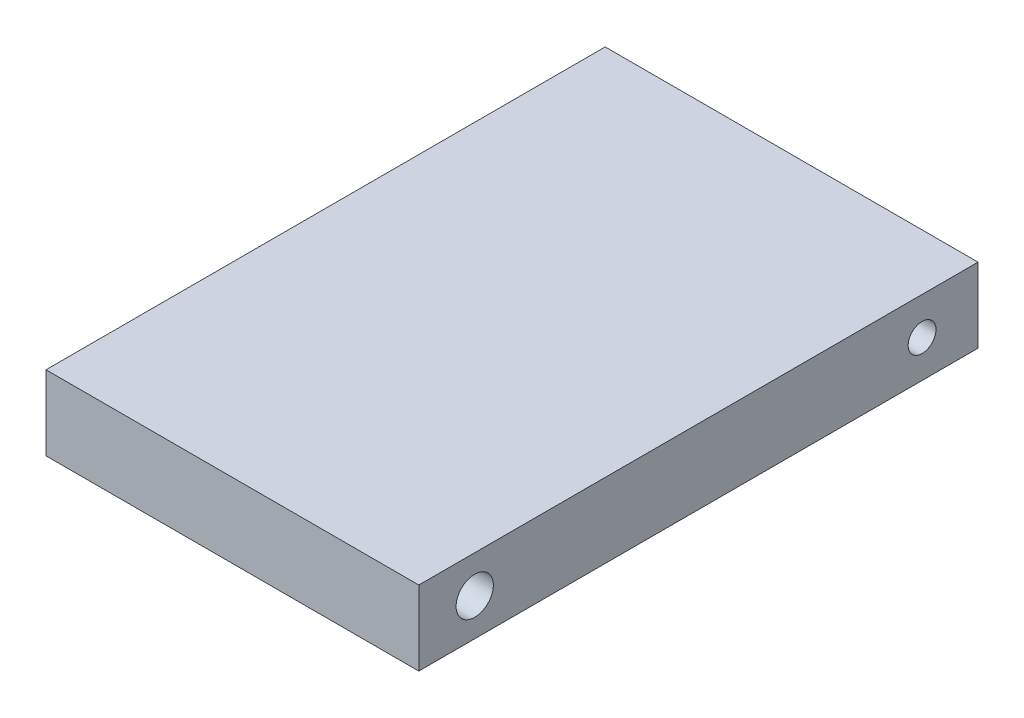
ISO-10303-21;
HEADER;
FILE_DESCRIPTION(('STEP AP214'),'2;1');
FILE_NAME('part.step','',(''),(''),'','','');
FILE_SCHEMA(('AUTOMOTIVE_DESIGN { 1 0 10303 214 1 1 1 1 }'));
ENDSEC;
DATA;
#1=APPLICATION_CONTEXT('core data for automotive mechanical design processes');
#2=APPLICATION_PROTOCOL_DEFINITION('international standard','automotive_design',2000,#1);
#3=PRODUCT_CONTEXT('',#1,'mechanical');
#4=PRODUCT('Part','Part','',(#3));
#5=PRODUCT_RELATED_PRODUCT_CATEGORY('part','',(#4));
#6=PRODUCT_DEFINITION_FORMATION('','',#4);
#7=PRODUCT_DEFINITION_CONTEXT('part definition',#1,'design');
#8=PRODUCT_DEFINITION('design','',#6,#7);
#9=PRODUCT_DEFINITION_SHAPE('','',#8);
#10=(LENGTH_UNIT() NAMED_UNIT(*) SI_UNIT(.MILLI.,.METRE.));
#11=(NAMED_UNIT(*) PLANE_ANGLE_UNIT() SI_UNIT($,.RADIAN.));
#12=(NAMED_UNIT(*) SI_UNIT($,.STERADIAN.) SOLID_ANGLE_UNIT());
#13=UNCERTAINTY_MEASURE_WITH_UNIT(LENGTH_MEASURE(1.E-05),#10,'distance_accuracy_value','');
#14=(GEOMETRIC_REPRESENTATION_CONTEXT(3) GLOBAL_UNCERTAINTY_ASSIGNED_CONTEXT((#13)) GLOBAL_UNIT_ASSIGNED_CONTEXT((#10,
#11,#12)) REPRESENTATION_CONTEXT('',''));
#15=CARTESIAN_POINT('',(0.,0.,0.));
#16=DIRECTION('',(0.,0.,1.));
#17=DIRECTION('',(1.,0.,0.));
#18=AXIS2_PLACEMENT_3D('',#15,#16,#17);
#19=CARTESIAN_POINT('',(0.,25.4,-190.5));
#20=DIRECTION('',(1.,0.,0.));
#21=DIRECTION('',(0.,0.,-1.));
#22=AXIS2_PLACEMENT_3D('',#19,#20,#21);
#23=PLANE('',#22);
#24=CARTESIAN_POINT('',(0.,12.7,-171.45));
#25=DIRECTION('',(-1.,0.,0.));
#26=DIRECTION('',(0.,0.,1.));
#27=AXIS2_PLACEMENT_3D('',#24,#25,#26);
#28=CIRCLE('',#27,6.35);
#29=CARTESIAN_POINT('',(0.,12.7,-165.1));
#30=VERTEX_POINT('',#29);
#31=EDGE_CURVE('E128',#30,#30,#28,.T.);
#32=ORIENTED_EDGE('',*,*,#31,.F.);
#33=EDGE_LOOP('',(#32));
#34=FACE_BOUND('',#33,.T.);
#35=CARTESIAN_POINT('',(0.,12.7,-19.05));
#36=DIRECTION('',(-1.,0.,0.));
#37=DIRECTION('',(0.,0.,1.));
#38=AXIS2_PLACEMENT_3D('',#35,#36,#37);
#39=CIRCLE('',#38,6.35);
#40=CARTESIAN_POINT('',(0.,12.7,-12.7));
#41=VERTEX_POINT('',#40);
#42=EDGE_CURVE('E122',#41,#41,#39,.T.);
#43=ORIENTED_EDGE('',*,*,#42,.F.);
#44=EDGE_LOOP('',(#43));
#45=FACE_BOUND('',#44,.T.);
#46=DIRECTION('',(0.,0.,1.));
#47=VECTOR('',#46,1.);
#48=CARTESIAN_POINT('',(0.,0.,-190.5));
#49=LINE('',#48,#47);
#50=CARTESIAN_POINT('',(0.,0.,-190.5));
#51=VERTEX_POINT('',#50);
#52=CARTESIAN_POINT('',(0.,0.,0.));
#53=VERTEX_POINT('',#52);
#54=EDGE_CURVE('E96',#51,#53,#49,.T.);
#55=ORIENTED_EDGE('',*,*,#54,.T.);
#56=DIRECTION('',(0.,-1.,0.));
#57=VECTOR('',#56,1.);
#58=CARTESIAN_POINT('',(0.,25.4,0.));
#59=LINE('',#58,#57);
#60=CARTESIAN_POINT('',(0.,25.4,0.));
#61=VERTEX_POINT('',#60);
#62=EDGE_CURVE('E11',#61,#53,#59,.T.);
#63=ORIENTED_EDGE('',*,*,#62,.F.);
#64=DIRECTION('',(0.,0.,1.));
#65=VECTOR('',#64,1.);
#66=CARTESIAN_POINT('',(0.,25.4,-190.5));
#67=LINE('',#66,#65);
#68=CARTESIAN_POINT('',(0.,25.4,-190.5));
#69=VERTEX_POINT('',#68);
#70=EDGE_CURVE('E84',#69,#61,#67,.T.);
#71=ORIENTED_EDGE('',*,*,#70,.F.);
#72=DIRECTION('',(0.,-1.,0.));
#73=VECTOR('',#72,1.);
#74=CARTESIAN_POINT('',(0.,25.4,-190.5));
#75=LINE('',#74,#73);
#76=EDGE_CURVE('E92',#69,#51,#75,.T.);
#77=ORIENTED_EDGE('',*,*,#76,.T.);
#78=EDGE_LOOP('',(#55,#63,#71,#77));
#79=FACE_BOUND('',#78,.T.);
#80=ADVANCED_FACE('F33',(#34,#45,#79),#23,.F.);
#81=CARTESIAN_POINT('',(0.,25.4,0.));
#82=DIRECTION('',(0.,0.,-1.));
#83=DIRECTION('',(-1.,0.,0.));
#84=AXIS2_PLACEMENT_3D('',#81,#82,#83);
#85=PLANE('',#84);
#86=DIRECTION('',(1.,0.,0.));
#87=VECTOR('',#86,1.);
#88=CARTESIAN_POINT('',(0.,0.,0.));
#89=LINE('',#88,#87);
#90=CARTESIAN_POINT('',(127.,0.,0.));
#91=VERTEX_POINT('',#90);
#92=EDGE_CURVE('E88',#53,#91,#89,.T.);
#93=ORIENTED_EDGE('',*,*,#92,.T.);
#94=DIRECTION('',(0.,-1.,0.));
#95=VECTOR('',#94,1.);
#96=CARTESIAN_POINT('',(127.,25.4,0.));
#97=LINE('',#96,#95);
#98=CARTESIAN_POINT('',(127.,25.4,0.));
#99=VERTEX_POINT('',#98);
#100=EDGE_CURVE('E41',#99,#91,#97,.T.);
#101=ORIENTED_EDGE('',*,*,#100,.F.);
#102=DIRECTION('',(1.,0.,0.));
#103=VECTOR('',#102,1.);
#104=CARTESIAN_POINT('',(0.,25.4,0.));
#105=LINE('',#104,#103);
#106=EDGE_CURVE('E79',#61,#99,#105,.T.);
#107=ORIENTED_EDGE('',*,*,#106,.F.);
#108=ORIENTED_EDGE('',*,*,#62,.T.);
#109=EDGE_LOOP('',(#93,#101,#107,#108));
#110=FACE_BOUND('',#109,.T.);
#111=ADVANCED_FACE('F87',(#110),#85,.F.);
#112=CARTESIAN_POINT('',(127.,25.4,0.));
#113=DIRECTION('',(-1.,0.,0.));
#114=DIRECTION('',(0.,0.,1.));
#115=AXIS2_PLACEMENT_3D('',#112,#113,#114);
#116=PLANE('',#115);
#117=CARTESIAN_POINT('',(127.,12.7,-171.45));
#118=DIRECTION('',(1.,0.,0.));
#119=DIRECTION('',(0.,0.,-1.));
#120=AXIS2_PLACEMENT_3D('',#117,#118,#119);
#121=CIRCLE('',#120,4.74112595679173);
#122=CARTESIAN_POINT('',(127.,12.7,-176.191125956792));
#123=VERTEX_POINT('',#122);
#124=EDGE_CURVE('E116',#123,#123,#121,.T.);
#125=ORIENTED_EDGE('',*,*,#124,.F.);
#126=EDGE_LOOP('',(#125));
#127=FACE_BOUND('',#126,.T.);
#128=CARTESIAN_POINT('',(127.,12.7,-19.05));
#129=DIRECTION('',(1.,0.,0.));
#130=DIRECTION('',(0.,0.,-1.));
#131=AXIS2_PLACEMENT_3D('',#128,#129,#130);
#132=CIRCLE('',#131,6.35);
#133=CARTESIAN_POINT('',(127.,12.7,-25.4));
#134=VERTEX_POINT('',#133);
#135=EDGE_CURVE('E110',#134,#134,#132,.T.);
#136=ORIENTED_EDGE('',*,*,#135,.F.);
#137=EDGE_LOOP('',(#136));
#138=FACE_BOUND('',#137,.T.);
#139=DIRECTION('',(0.,0.,-1.));
#140=VECTOR('',#139,1.);
#141=CARTESIAN_POINT('',(127.,0.,0.));
#142=LINE('',#141,#140);
#143=CARTESIAN_POINT('',(127.,0.,-190.5));
#144=VERTEX_POINT('',#143);
#145=EDGE_CURVE('E66',#91,#144,#142,.T.);
#146=ORIENTED_EDGE('',*,*,#145,.T.);
#147=DIRECTION('',(0.,-1.,0.));
#148=VECTOR('',#147,1.);
#149=CARTESIAN_POINT('',(127.,25.4,-190.5));
#150=LINE('',#149,#148);
#151=CARTESIAN_POINT('',(127.,25.4,-190.5));
#152=VERTEX_POINT('',#151);
#153=EDGE_CURVE('E89',#152,#144,#150,.T.);
#154=ORIENTED_EDGE('',*,*,#153,.F.);
#155=DIRECTION('',(0.,0.,-1.));
#156=VECTOR('',#155,1.);
#157=CARTESIAN_POINT('',(127.,25.4,0.));
#158=LINE('',#157,#156);
#159=EDGE_CURVE('E82',#99,#152,#158,.T.);
#160=ORIENTED_EDGE('',*,*,#159,.F.);
#161=ORIENTED_EDGE('',*,*,#100,.T.);
#162=EDGE_LOOP('',(#146,#154,#160,#161));
#163=FACE_BOUND('',#162,.T.);
#164=ADVANCED_FACE('F90',(#127,#138,#163),#116,.F.);
#165=CARTESIAN_POINT('',(127.,25.4,-190.5));
#166=DIRECTION('',(0.,0.,1.));
#167=DIRECTION('',(1.,0.,0.));
#168=AXIS2_PLACEMENT_3D('',#165,#166,#167);
#169=PLANE('',#168);
#170=DIRECTION('',(-1.,0.,0.));
#171=VECTOR('',#170,1.);
#172=CARTESIAN_POINT('',(127.,0.,-190.5));
#173=LINE('',#172,#171);
#174=EDGE_CURVE('E72',#144,#51,#173,.T.);
#175=ORIENTED_EDGE('',*,*,#174,.T.);
#176=ORIENTED_EDGE('',*,*,#76,.F.);
#177=DIRECTION('',(-1.,0.,0.));
#178=VECTOR('',#177,1.);
#179=CARTESIAN_POINT('',(127.,25.4,-190.5));
#180=LINE('',#179,#178);
#181=EDGE_CURVE('E49',#152,#69,#180,.T.);
#182=ORIENTED_EDGE('',*,*,#181,.F.);
#183=ORIENTED_EDGE('',*,*,#153,.T.);
#184=EDGE_LOOP('',(#175,#176,#182,#183));
#185=FACE_BOUND('',#184,.T.);
#186=ADVANCED_FACE('F104',(#185),#169,.F.);
#187=CARTESIAN_POINT('',(0.,25.4,0.));
#188=DIRECTION('',(0.,1.,0.));
#189=DIRECTION('',(0.,0.,1.));
#190=AXIS2_PLACEMENT_3D('',#187,#188,#189);
#191=PLANE('',#190);
#192=ORIENTED_EDGE('',*,*,#70,.T.);
#193=ORIENTED_EDGE('',*,*,#106,.T.);
#194=ORIENTED_EDGE('',*,*,#159,.T.);
#195=ORIENTED_EDGE('',*,*,#181,.T.);
#196=EDGE_LOOP('',(#192,#193,#194,#195));
#197=FACE_BOUND('',#196,.T.);
#198=ADVANCED_FACE('F80',(#197),#191,.T.);
#199=CARTESIAN_POINT('',(0.,0.,0.));
#200=DIRECTION('',(0.,1.,0.));
#201=DIRECTION('',(0.,0.,1.));
#202=AXIS2_PLACEMENT_3D('',#199,#200,#201);
#203=PLANE('',#202);
#204=ORIENTED_EDGE('',*,*,#54,.F.);
#205=ORIENTED_EDGE('',*,*,#174,.F.);
#206=ORIENTED_EDGE('',*,*,#145,.F.);
#207=ORIENTED_EDGE('',*,*,#92,.F.);
#208=EDGE_LOOP('',(#204,#205,#206,#207));
#209=FACE_BOUND('',#208,.T.);
#210=ADVANCED_FACE('F107',(#209),#203,.F.);
#211=CARTESIAN_POINT('',(107.95,12.7,-19.05));
#212=DIRECTION('',(1.,0.,0.));
#213=DIRECTION('',(0.,0.,-1.));
#214=AXIS2_PLACEMENT_3D('',#211,#212,#213);
#215=CYLINDRICAL_SURFACE('',#214,6.35);
#216=CARTESIAN_POINT('',(107.95,12.7,-19.05));
#217=DIRECTION('',(1.,0.,0.));
#218=DIRECTION('',(0.,0.,-1.));
#219=AXIS2_PLACEMENT_3D('',#216,#217,#218);
#220=CIRCLE('',#219,6.35);
#221=CARTESIAN_POINT('',(107.95,12.7,-25.4));
#222=VERTEX_POINT('',#221);
#223=EDGE_CURVE('E99',#222,#222,#220,.T.);
#224=CARTESIAN_POINT('',(107.95,12.7,-25.4));
#225=CARTESIAN_POINT('',(108.1484375,12.7,-25.4));
#226=CARTESIAN_POINT('',(108.346875,12.7,-25.4));
#227=CARTESIAN_POINT('',(108.74375,12.7,-25.4));
#228=CARTESIAN_POINT('',(108.9421875,12.7,-25.4));
#229=CARTESIAN_POINT('',(109.3390625,12.7,-25.4));
#230=CARTESIAN_POINT('',(109.5375,12.7,-25.4));
#231=CARTESIAN_POINT('',(109.934375,12.7,-25.4));
#232=CARTESIAN_POINT('',(110.1328125,12.7,-25.4));
#233=CARTESIAN_POINT('',(110.5296875,12.7,-25.4));
#234=CARTESIAN_POINT('',(110.728125,12.7,-25.4));
#235=CARTESIAN_POINT('',(111.125,12.7,-25.4));
#236=CARTESIAN_POINT('',(111.3234375,12.7,-25.4));
#237=CARTESIAN_POINT('',(111.7203125,12.7,-25.4));
#238=CARTESIAN_POINT('',(111.91875,12.7,-25.4));
#239=CARTESIAN_POINT('',(112.315625,12.7,-25.4));
#240=CARTESIAN_POINT('',(112.5140625,12.7,-25.4));
#241=CARTESIAN_POINT('',(112.9109375,12.7,-25.4));
#242=CARTESIAN_POINT('',(113.109375,12.7,-25.4));
#243=CARTESIAN_POINT('',(113.50625,12.7,-25.4));
#244=CARTESIAN_POINT('',(113.7046875,12.7,-25.4));
#245=CARTESIAN_POINT('',(114.1015625,12.7,-25.4));
#246=CARTESIAN_POINT('',(114.3,12.7,-25.4));
#247=CARTESIAN_POINT('',(114.696875,12.7,-25.4));
#248=CARTESIAN_POINT('',(114.8953125,12.7,-25.4));
#249=CARTESIAN_POINT('',(115.2921875,12.7,-25.4));
#250=CARTESIAN_POINT('',(115.490625,12.7,-25.4));
#251=CARTESIAN_POINT('',(115.8875,12.7,-25.4));
#252=CARTESIAN_POINT('',(116.0859375,12.7,-25.4));
#253=CARTESIAN_POINT('',(116.4828125,12.7,-25.4));
#254=CARTESIAN_POINT('',(116.68125,12.7,-25.4));
#255=CARTESIAN_POINT('',(117.078125,12.7,-25.4));
#256=CARTESIAN_POINT('',(117.2765625,12.7,-25.4));
#257=CARTESIAN_POINT('',(117.6734375,12.7,-25.4));
#258=CARTESIAN_POINT('',(117.871875,12.7,-25.4));
#259=CARTESIAN_POINT('',(118.26875,12.7,-25.4));
#260=CARTESIAN_POINT('',(118.4671875,12.7,-25.4));
#261=CARTESIAN_POINT('',(118.8640625,12.7,-25.4));
#262=CARTESIAN_POINT('',(119.0625,12.7,-25.4));
#263=CARTESIAN_POINT('',(119.459375,12.7,-25.4));
#264=CARTESIAN_POINT('',(119.6578125,12.7,-25.4));
#265=CARTESIAN_POINT('',(120.0546875,12.7,-25.4));
#266=CARTESIAN_POINT('',(120.253125,12.7,-25.4));
#267=CARTESIAN_POINT('',(120.65,12.7,-25.4));
#268=CARTESIAN_POINT('',(120.8484375,12.7,-25.4));
#269=CARTESIAN_POINT('',(121.2453125,12.7,-25.4));
#270=CARTESIAN_POINT('',(121.44375,12.7,-25.4));
#271=CARTESIAN_POINT('',(121.840625,12.7,-25.4));
#272=CARTESIAN_POINT('',(122.0390625,12.7,-25.4));
#273=CARTESIAN_POINT('',(122.4359375,12.7,-25.4));
#274=CARTESIAN_POINT('',(122.634375,12.7,-25.4));
#275=CARTESIAN_POINT('',(123.03125,12.7,-25.4));
#276=CARTESIAN_POINT('',(123.2296875,12.7,-25.4));
#277=CARTESIAN_POINT('',(123.6265625,12.7,-25.4));
#278=CARTESIAN_POINT('',(123.825,12.7,-25.4));
#279=CARTESIAN_POINT('',(124.221875,12.7,-25.4));
#280=CARTESIAN_POINT('',(124.4203125,12.7,-25.4));
#281=CARTESIAN_POINT('',(124.8171875,12.7,-25.4));
#282=CARTESIAN_POINT('',(125.015625,12.7,-25.4));
#283=CARTESIAN_POINT('',(125.4125,12.7,-25.4));
#284=CARTESIAN_POINT('',(125.6109375,12.7,-25.4));
#285=CARTESIAN_POINT('',(126.0078125,12.7,-25.4));
#286=CARTESIAN_POINT('',(126.20625,12.7,-25.4));
#287=CARTESIAN_POINT('',(126.603125,12.7,-25.4));
#288=CARTESIAN_POINT('',(126.8015625,12.7,-25.4));
#289=CARTESIAN_POINT('',(127.,12.7,-25.4));
#290=B_SPLINE_CURVE_WITH_KNOTS('',3,(#224,#225,#226,#227,#228,#229,#230,#231,#232,#233,#234,
#235,#236,#237,#238,#239,#240,#241,#242,#243,#244,#245,#246,#247,#248,#249,#250,#251,#252,#253,
#254,#255,#256,#257,#258,#259,#260,#261,#262,#263,#264,#265,#266,#267,#268,#269,#270,#271,#272,
#273,#274,#275,#276,#277,#278,#279,#280,#281,#282,#283,#284,#285,#286,#287,#288,#289),
.UNSPECIFIED.,.F.,.F.,(4,2,2,2,2,2,2,2,2,2,2,2,2,2,2,2,2,2,2,2,2,2,2,2,2,2,2,2,2,2,2,2,4),(0.,
0.595312499999986,1.19062499999999,1.78593749999999,2.38124999999999,2.97656249999999,
3.57187499999999,4.16718749999999,4.76249999999999,5.35781249999999,5.95312499999999,
6.54843749999999,7.14374999999999,7.73906249999999,8.33437499999999,8.92968749999999,
9.52499999999999,10.1203125,10.715625,11.3109375,11.90625,12.5015625,13.096875,13.6921875,
14.2875,14.8828125,15.478125,16.0734375,16.66875,17.2640625,17.859375,18.4546875,19.05),.UNSPECIFIED.);
#291=EDGE_CURVE('BSEAM169',#222,#134,#290,.T.);
#292=ORIENTED_EDGE('',*,*,#223,.F.);
#293=ORIENTED_EDGE('',*,*,#135,.T.);
#294=ORIENTED_EDGE('',*,*,#291,.T.);
#295=ORIENTED_EDGE('',*,*,#291,.F.);
#296=EDGE_LOOP('',(#292,#294,#293,#295));
#297=FACE_BOUND('',#296,.T.);
#298=ADVANCED_FACE('F169',(#297),#215,.F.);
#299=CARTESIAN_POINT('',(107.95,12.7,-19.05));
#300=DIRECTION('',(1.,0.,0.));
#301=DIRECTION('',(0.,0.,-1.));
#302=AXIS2_PLACEMENT_3D('',#299,#300,#301);
#303=PLANE('',#302);
#304=ORIENTED_EDGE('',*,*,#223,.T.);
#305=EDGE_LOOP('',(#304));
#306=FACE_BOUND('',#305,.T.);
#307=ADVANCED_FACE('F165',(#306),#303,.T.);
#308=CARTESIAN_POINT('',(107.95,12.7,-171.45));
#309=DIRECTION('',(1.,0.,0.));
#310=DIRECTION('',(0.,0.,-1.));
#311=AXIS2_PLACEMENT_3D('',#308,#309,#310);
#312=CYLINDRICAL_SURFACE('',#311,4.74112595679173);
#313=CARTESIAN_POINT('',(107.95,12.7,-171.45));
#314=DIRECTION('',(1.,0.,0.));
#315=DIRECTION('',(0.,0.,-1.));
#316=AXIS2_PLACEMENT_3D('',#313,#314,#315);
#317=CIRCLE('',#316,4.74112595679173);
#318=CARTESIAN_POINT('',(107.95,12.7,-176.191125956792));
#319=VERTEX_POINT('',#318);
#320=EDGE_CURVE('E113',#319,#319,#317,.T.);
#321=CARTESIAN_POINT('',(107.95,12.7,-176.191125956792));
#322=CARTESIAN_POINT('',(108.1484375,12.7,-176.191125956792));
#323=CARTESIAN_POINT('',(108.346875,12.7,-176.191125956792));
#324=CARTESIAN_POINT('',(108.74375,12.7,-176.191125956792));
#325=CARTESIAN_POINT('',(108.9421875,12.7,-176.191125956792));
#326=CARTESIAN_POINT('',(109.3390625,12.7,-176.191125956792));
#327=CARTESIAN_POINT('',(109.5375,12.7,-176.191125956792));
#328=CARTESIAN_POINT('',(109.934375,12.7,-176.191125956792));
#329=CARTESIAN_POINT('',(110.1328125,12.7,-176.191125956792));
#330=CARTESIAN_POINT('',(110.5296875,12.7,-176.191125956792));
#331=CARTESIAN_POINT('',(110.728125,12.7,-176.191125956792));
#332=CARTESIAN_POINT('',(111.125,12.7,-176.191125956792));
#333=CARTESIAN_POINT('',(111.3234375,12.7,-176.191125956792));
#334=CARTESIAN_POINT('',(111.7203125,12.7,-176.191125956792));
#335=CARTESIAN_POINT('',(111.91875,12.7,-176.191125956792));
#336=CARTESIAN_POINT('',(112.315625,12.7,-176.191125956792));
#337=CARTESIAN_POINT('',(112.5140625,12.7,-176.191125956792));
#338=CARTESIAN_POINT('',(112.9109375,12.7,-176.191125956792));
#339=CARTESIAN_POINT('',(113.109375,12.7,-176.191125956792));
#340=CARTESIAN_POINT('',(113.50625,12.7,-176.191125956792));
#341=CARTESIAN_POINT('',(113.7046875,12.7,-176.191125956792));
#342=CARTESIAN_POINT('',(114.1015625,12.7,-176.191125956792));
#343=CARTESIAN_POINT('',(114.3,12.7,-176.191125956792));
#344=CARTESIAN_POINT('',(114.696875,12.7,-176.191125956792));
#345=CARTESIAN_POINT('',(114.8953125,12.7,-176.191125956792));
#346=CARTESIAN_POINT('',(115.2921875,12.7,-176.191125956792));
#347=CARTESIAN_POINT('',(115.490625,12.7,-176.191125956792));
#348=CARTESIAN_POINT('',(115.8875,12.7,-176.191125956792));
#349=CARTESIAN_POINT('',(116.0859375,12.7,-176.191125956792));
#350=CARTESIAN_POINT('',(116.4828125,12.7,-176.191125956792));
#351=CARTESIAN_POINT('',(116.68125,12.7,-176.191125956792));
#352=CARTESIAN_POINT('',(117.078125,12.7,-176.191125956792));
#353=CARTESIAN_POINT('',(117.2765625,12.7,-176.191125956792));
#354=CARTESIAN_POINT('',(117.6734375,12.7,-176.191125956792));
#355=CARTESIAN_POINT('',(117.871875,12.7,-176.191125956792));
#356=CARTESIAN_POINT('',(118.26875,12.7,-176.191125956792));
#357=CARTESIAN_POINT('',(118.4671875,12.7,-176.191125956792));
#358=CARTESIAN_POINT('',(118.8640625,12.7,-176.191125956792));
#359=CARTESIAN_POINT('',(119.0625,12.7,-176.191125956792));
#360=CARTESIAN_POINT('',(119.459375,12.7,-176.191125956792));
#361=CARTESIAN_POINT('',(119.6578125,12.7,-176.191125956792));
#362=CARTESIAN_POINT('',(120.0546875,12.7,-176.191125956792));
#363=CARTESIAN_POINT('',(120.253125,12.7,-176.191125956792));
#364=CARTESIAN_POINT('',(120.65,12.7,-176.191125956792));
#365=CARTESIAN_POINT('',(120.8484375,12.7,-176.191125956792));
#366=CARTESIAN_POINT('',(121.2453125,12.7,-176.191125956792));
#367=CARTESIAN_POINT('',(121.44375,12.7,-176.191125956792));
#368=CARTESIAN_POINT('',(121.840625,12.7,-176.191125956792));
#369=CARTESIAN_POINT('',(122.0390625,12.7,-176.191125956792));
#370=CARTESIAN_POINT('',(122.4359375,12.7,-176.191125956792));
#371=CARTESIAN_POINT('',(122.634375,12.7,-176.191125956792));
#372=CARTESIAN_POINT('',(123.03125,12.7,-176.191125956792));
#373=CARTESIAN_POINT('',(123.2296875,12.7,-176.191125956792));
#374=CARTESIAN_POINT('',(123.6265625,12.7,-176.191125956792));
#375=CARTESIAN_POINT('',(123.825,12.7,-176.191125956792));
#376=CARTESIAN_POINT('',(124.221875,12.7,-176.191125956792));
#377=CARTESIAN_POINT('',(124.4203125,12.7,-176.191125956792));
#378=CARTESIAN_POINT('',(124.8171875,12.7,-176.191125956792));
#379=CARTESIAN_POINT('',(125.015625,12.7,-176.191125956792));
#380=CARTESIAN_POINT('',(125.4125,12.7,-176.191125956792));
#381=CARTESIAN_POINT('',(125.6109375,12.7,-176.191125956792));
#382=CARTESIAN_POINT('',(126.0078125,12.7,-176.191125956792));
#383=CARTESIAN_POINT('',(126.20625,12.7,-176.191125956792));
#384=CARTESIAN_POINT('',(126.603125,12.7,-176.191125956792));
#385=CARTESIAN_POINT('',(126.8015625,12.7,-176.191125956792));
#386=CARTESIAN_POINT('',(127.,12.7,-176.191125956792));
#387=B_SPLINE_CURVE_WITH_KNOTS('',3,(#321,#322,#323,#324,#325,#326,#327,#328,#329,#330,#331,
#332,#333,#334,#335,#336,#337,#338,#339,#340,#341,#342,#343,#344,#345,#346,#347,#348,#349,#350,
#351,#352,#353,#354,#355,#356,#357,#358,#359,#360,#361,#362,#363,#364,#365,#366,#367,#368,#369,
#370,#371,#372,#373,#374,#375,#376,#377,#378,#379,#380,#381,#382,#383,#384,#385,#386),
.UNSPECIFIED.,.F.,.F.,(4,2,2,2,2,2,2,2,2,2,2,2,2,2,2,2,2,2,2,2,2,2,2,2,2,2,2,2,2,2,2,2,4),(0.,
0.595312499999986,1.19062499999999,1.78593749999999,2.38124999999999,2.97656249999999,
3.57187499999999,4.16718749999999,4.76249999999999,5.35781249999999,5.95312499999999,
6.54843749999999,7.14374999999999,7.73906249999999,8.33437499999999,8.92968749999999,
9.52499999999999,10.1203125,10.715625,11.3109375,11.90625,12.5015625,13.096875,13.6921875,
14.2875,14.8828125,15.478125,16.0734375,16.66875,17.2640625,17.859375,18.4546875,19.05),.UNSPECIFIED.);
#388=EDGE_CURVE('BSEAM158',#319,#123,#387,.T.);
#389=ORIENTED_EDGE('',*,*,#320,.F.);
#390=ORIENTED_EDGE('',*,*,#124,.T.);
#391=ORIENTED_EDGE('',*,*,#388,.T.);
#392=ORIENTED_EDGE('',*,*,#388,.F.);
#393=EDGE_LOOP('',(#389,#391,#390,#392));
#394=FACE_BOUND('',#393,.T.);
#395=ADVANCED_FACE('F158',(#394),#312,.F.);
#396=CARTESIAN_POINT('',(107.95,12.7,-171.45));
#397=DIRECTION('',(1.,0.,0.));
#398=DIRECTION('',(0.,0.,-1.));
#399=AXIS2_PLACEMENT_3D('',#396,#397,#398);
#400=PLANE('',#399);
#401=ORIENTED_EDGE('',*,*,#320,.T.);
#402=EDGE_LOOP('',(#401));
#403=FACE_BOUND('',#402,.T.);
#404=ADVANCED_FACE('F149',(#403),#400,.T.);
#405=CARTESIAN_POINT('',(19.05,12.7,-19.05));
#406=DIRECTION('',(-1.,0.,0.));
#407=DIRECTION('',(0.,0.,1.));
#408=AXIS2_PLACEMENT_3D('',#405,#406,#407);
#409=CYLINDRICAL_SURFACE('',#408,6.35);
#410=CARTESIAN_POINT('',(19.05,12.7,-19.05));
#411=DIRECTION('',(-1.,0.,0.));
#412=DIRECTION('',(0.,0.,1.));
#413=AXIS2_PLACEMENT_3D('',#410,#411,#412);
#414=CIRCLE('',#413,6.35);
#415=CARTESIAN_POINT('',(19.05,12.7,-12.7));
#416=VERTEX_POINT('',#415);
#417=EDGE_CURVE('E125',#416,#416,#414,.T.);
#418=CARTESIAN_POINT('',(19.05,12.7,-12.7));
#419=CARTESIAN_POINT('',(18.8515625,12.7,-12.7));
#420=CARTESIAN_POINT('',(18.653125,12.7,-12.7));
#421=CARTESIAN_POINT('',(18.25625,12.7,-12.7));
#422=CARTESIAN_POINT('',(18.0578125,12.7,-12.7));
#423=CARTESIAN_POINT('',(17.6609375,12.7,-12.7));
#424=CARTESIAN_POINT('',(17.4625,12.7,-12.7));
#425=CARTESIAN_POINT('',(17.065625,12.7,-12.7));
#426=CARTESIAN_POINT('',(16.8671875,12.7,-12.7));
#427=CARTESIAN_POINT('',(16.4703125,12.7,-12.7));
#428=CARTESIAN_POINT('',(16.271875,12.7,-12.7));
#429=CARTESIAN_POINT('',(15.875,12.7,-12.7));
#430=CARTESIAN_POINT('',(15.6765625,12.7,-12.7));
#431=CARTESIAN_POINT('',(15.2796875,12.7,-12.7));
#432=CARTESIAN_POINT('',(15.08125,12.7,-12.7));
#433=CARTESIAN_POINT('',(14.684375,12.7,-12.7));
#434=CARTESIAN_POINT('',(14.4859375,12.7,-12.7));
#435=CARTESIAN_POINT('',(14.0890625,12.7,-12.7));
#436=CARTESIAN_POINT('',(13.890625,12.7,-12.7));
#437=CARTESIAN_POINT('',(13.49375,12.7,-12.7));
#438=CARTESIAN_POINT('',(13.2953125,12.7,-12.7));
#439=CARTESIAN_POINT('',(12.8984375,12.7,-12.7));
#440=CARTESIAN_POINT('',(12.7,12.7,-12.7));
#441=CARTESIAN_POINT('',(12.303125,12.7,-12.7));
#442=CARTESIAN_POINT('',(12.1046875,12.7,-12.7));
#443=CARTESIAN_POINT('',(11.7078125,12.7,-12.7));
#444=CARTESIAN_POINT('',(11.509375,12.7,-12.7));
#445=CARTESIAN_POINT('',(11.1125,12.7,-12.7));
#446=CARTESIAN_POINT('',(10.9140625,12.7,-12.7));
#447=CARTESIAN_POINT('',(10.5171875,12.7,-12.7));
#448=CARTESIAN_POINT('',(10.31875,12.7,-12.7));
#449=CARTESIAN_POINT('',(9.921875,12.7,-12.7));
#450=CARTESIAN_POINT('',(9.7234375,12.7,-12.7));
#451=CARTESIAN_POINT('',(9.3265625,12.7,-12.7));
#452=CARTESIAN_POINT('',(9.128125,12.7,-12.7));
#453=CARTESIAN_POINT('',(8.73125,12.7,-12.7));
#454=CARTESIAN_POINT('',(8.5328125,12.7,-12.7));
#455=CARTESIAN_POINT('',(8.1359375,12.7,-12.7));
#456=CARTESIAN_POINT('',(7.9375,12.7,-12.7));
#457=CARTESIAN_POINT('',(7.540625,12.7,-12.7));
#458=CARTESIAN_POINT('',(7.3421875,12.7,-12.7));
#459=CARTESIAN_POINT('',(6.9453125,12.7,-12.7));
#460=CARTESIAN_POINT('',(6.746875,12.7,-12.7));
#461=CARTESIAN_POINT('',(6.35,12.7,-12.7));
#462=CARTESIAN_POINT('',(6.1515625,12.7,-12.7));
#463=CARTESIAN_POINT('',(5.7546875,12.7,-12.7));
#464=CARTESIAN_POINT('',(5.55625,12.7,-12.7));
#465=CARTESIAN_POINT('',(5.159375,12.7,-12.7));
#466=CARTESIAN_POINT('',(4.9609375,12.7,-12.7));
#467=CARTESIAN_POINT('',(4.5640625,12.7,-12.7));
#468=CARTESIAN_POINT('',(4.365625,12.7,-12.7));
#469=CARTESIAN_POINT('',(3.96875,12.7,-12.7));
#470=CARTESIAN_POINT('',(3.7703125,12.7,-12.7));
#471=CARTESIAN_POINT('',(3.3734375,12.7,-12.7));
#472=CARTESIAN_POINT('',(3.175,12.7,-12.7));
#473=CARTESIAN_POINT('',(2.778125,12.7,-12.7));
#474=CARTESIAN_POINT('',(2.5796875,12.7,-12.7));
#475=CARTESIAN_POINT('',(2.1828125,12.7,-12.7));
#476=CARTESIAN_POINT('',(1.984375,12.7,-12.7));
#477=CARTESIAN_POINT('',(1.5875,12.7,-12.7));
#478=CARTESIAN_POINT('',(1.3890625,12.7,-12.7));
#479=CARTESIAN_POINT('',(0.992187500000001,12.7,-12.7));
#480=CARTESIAN_POINT('',(0.793750000000001,12.7,-12.7));
#481=CARTESIAN_POINT('',(0.396875,12.7,-12.7));
#482=CARTESIAN_POINT('',(0.1984375,12.7,-12.7));
#483=CARTESIAN_POINT('',(0.,12.7,-12.7));
#484=B_SPLINE_CURVE_WITH_KNOTS('',3,(#418,#419,#420,#421,#422,#423,#424,#425,#426,#427,#428,
#429,#430,#431,#432,#433,#434,#435,#436,#437,#438,#439,#440,#441,#442,#443,#444,#445,#446,#447,
#448,#449,#450,#451,#452,#453,#454,#455,#456,#457,#458,#459,#460,#461,#462,#463,#464,#465,#466,
#467,#468,#469,#470,#471,#472,#473,#474,#475,#476,#477,#478,#479,#480,#481,#482,#483),
.UNSPECIFIED.,.F.,.F.,(4,2,2,2,2,2,2,2,2,2,2,2,2,2,2,2,2,2,2,2,2,2,2,2,2,2,2,2,2,2,2,2,4),(0.,
0.595312499999997,1.190625,1.7859375,2.38125,2.9765625,3.571875,4.1671875,4.7625,5.3578125,
5.953125,6.5484375,7.14375,7.7390625,8.334375,8.9296875,9.525,10.1203125,10.715625,11.3109375,
11.90625,12.5015625,13.096875,13.6921875,14.2875,14.8828125,15.478125,16.0734375,16.66875,
17.2640625,17.859375,18.4546875,19.05),.UNSPECIFIED.);
#485=EDGE_CURVE('BSEAM147',#416,#41,#484,.T.);
#486=ORIENTED_EDGE('',*,*,#417,.F.);
#487=ORIENTED_EDGE('',*,*,#42,.T.);
#488=ORIENTED_EDGE('',*,*,#485,.T.);
#489=ORIENTED_EDGE('',*,*,#485,.F.);
#490=EDGE_LOOP('',(#486,#488,#487,#489));
#491=FACE_BOUND('',#490,.T.);
#492=ADVANCED_FACE('F147',(#491),#409,.F.);
#493=CARTESIAN_POINT('',(19.05,12.7,-19.05));
#494=DIRECTION('',(-1.,0.,0.));
#495=DIRECTION('',(0.,0.,1.));
#496=AXIS2_PLACEMENT_3D('',#493,#494,#495);
#497=PLANE('',#496);
#498=ORIENTED_EDGE('',*,*,#417,.T.);
#499=EDGE_LOOP('',(#498));
#500=FACE_BOUND('',#499,.T.);
#501=ADVANCED_FACE('F139',(#500),#497,.T.);
#502=CARTESIAN_POINT('',(19.05,12.7,-171.45));
#503=DIRECTION('',(-1.,0.,0.));
#504=DIRECTION('',(0.,0.,1.));
#505=AXIS2_PLACEMENT_3D('',#502,#503,#504);
#506=CYLINDRICAL_SURFACE('',#505,6.35);
#507=CARTESIAN_POINT('',(19.05,12.7,-171.45));
#508=DIRECTION('',(-1.,0.,0.));
#509=DIRECTION('',(0.,0.,1.));
#510=AXIS2_PLACEMENT_3D('',#507,#508,#509);
#511=CIRCLE('',#510,6.35);
#512=CARTESIAN_POINT('',(19.05,12.7,-165.1));
#513=VERTEX_POINT('',#512);
#514=EDGE_CURVE('E119',#513,#513,#511,.T.);
#515=CARTESIAN_POINT('',(19.05,12.7,-165.1));
#516=CARTESIAN_POINT('',(18.8515625,12.7,-165.1));
#517=CARTESIAN_POINT('',(18.653125,12.7,-165.1));
#518=CARTESIAN_POINT('',(18.25625,12.7,-165.1));
#519=CARTESIAN_POINT('',(18.0578125,12.7,-165.1));
#520=CARTESIAN_POINT('',(17.6609375,12.7,-165.1));
#521=CARTESIAN_POINT('',(17.4625,12.7,-165.1));
#522=CARTESIAN_POINT('',(17.065625,12.7,-165.1));
#523=CARTESIAN_POINT('',(16.8671875,12.7,-165.1));
#524=CARTESIAN_POINT('',(16.4703125,12.7,-165.1));
#525=CARTESIAN_POINT('',(16.271875,12.7,-165.1));
#526=CARTESIAN_POINT('',(15.875,12.7,-165.1));
#527=CARTESIAN_POINT('',(15.6765625,12.7,-165.1));
#528=CARTESIAN_POINT('',(15.2796875,12.7,-165.1));
#529=CARTESIAN_POINT('',(15.08125,12.7,-165.1));
#530=CARTESIAN_POINT('',(14.684375,12.7,-165.1));
#531=CARTESIAN_POINT('',(14.4859375,12.7,-165.1));
#532=CARTESIAN_POINT('',(14.0890625,12.7,-165.1));
#533=CARTESIAN_POINT('',(13.890625,12.7,-165.1));
#534=CARTESIAN_POINT('',(13.49375,12.7,-165.1));
#535=CARTESIAN_POINT('',(13.2953125,12.7,-165.1));
#536=CARTESIAN_POINT('',(12.8984375,12.7,-165.1));
#537=CARTESIAN_POINT('',(12.7,12.7,-165.1));
#538=CARTESIAN_POINT('',(12.303125,12.7,-165.1));
#539=CARTESIAN_POINT('',(12.1046875,12.7,-165.1));
#540=CARTESIAN_POINT('',(11.7078125,12.7,-165.1));
#541=CARTESIAN_POINT('',(11.509375,12.7,-165.1));
#542=CARTESIAN_POINT('',(11.1125,12.7,-165.1));
#543=CARTESIAN_POINT('',(10.9140625,12.7,-165.1));
#544=CARTESIAN_POINT('',(10.5171875,12.7,-165.1));
#545=CARTESIAN_POINT('',(10.31875,12.7,-165.1));
#546=CARTESIAN_POINT('',(9.921875,12.7,-165.1));
#547=CARTESIAN_POINT('',(9.7234375,12.7,-165.1));
#548=CARTESIAN_POINT('',(9.3265625,12.7,-165.1));
#549=CARTESIAN_POINT('',(9.128125,12.7,-165.1));
#550=CARTESIAN_POINT('',(8.73125,12.7,-165.1));
#551=CARTESIAN_POINT('',(8.5328125,12.7,-165.1));
#552=CARTESIAN_POINT('',(8.1359375,12.7,-165.1));
#553=CARTESIAN_POINT('',(7.9375,12.7,-165.1));
#554=CARTESIAN_POINT('',(7.540625,12.7,-165.1));
#555=CARTESIAN_POINT('',(7.3421875,12.7,-165.1));
#556=CARTESIAN_POINT('',(6.9453125,12.7,-165.1));
#557=CARTESIAN_POINT('',(6.746875,12.7,-165.1));
#558=CARTESIAN_POINT('',(6.35,12.7,-165.1));
#559=CARTESIAN_POINT('',(6.1515625,12.7,-165.1));
#560=CARTESIAN_POINT('',(5.7546875,12.7,-165.1));
#561=CARTESIAN_POINT('',(5.55625,12.7,-165.1));
#562=CARTESIAN_POINT('',(5.159375,12.7,-165.1));
#563=CARTESIAN_POINT('',(4.9609375,12.7,-165.1));
#564=CARTESIAN_POINT('',(4.5640625,12.7,-165.1));
#565=CARTESIAN_POINT('',(4.365625,12.7,-165.1));
#566=CARTESIAN_POINT('',(3.96875,12.7,-165.1));
#567=CARTESIAN_POINT('',(3.7703125,12.7,-165.1));
#568=CARTESIAN_POINT('',(3.3734375,12.7,-165.1));
#569=CARTESIAN_POINT('',(3.175,12.7,-165.1));
#570=CARTESIAN_POINT('',(2.778125,12.7,-165.1));
#571=CARTESIAN_POINT('',(2.5796875,12.7,-165.1));
#572=CARTESIAN_POINT('',(2.1828125,12.7,-165.1));
#573=CARTESIAN_POINT('',(1.984375,12.7,-165.1));
#574=CARTESIAN_POINT('',(1.5875,12.7,-165.1));
#575=CARTESIAN_POINT('',(1.3890625,12.7,-165.1));
#576=CARTESIAN_POINT('',(0.992187500000001,12.7,-165.1));
#577=CARTESIAN_POINT('',(0.793750000000001,12.7,-165.1));
#578=CARTESIAN_POINT('',(0.396875,12.7,-165.1));
#579=CARTESIAN_POINT('',(0.1984375,12.7,-165.1));
#580=CARTESIAN_POINT('',(0.,12.7,-165.1));
#581=B_SPLINE_CURVE_WITH_KNOTS('',3,(#515,#516,#517,#518,#519,#520,#521,#522,#523,#524,#525,
#526,#527,#528,#529,#530,#531,#532,#533,#534,#535,#536,#537,#538,#539,#540,#541,#542,#543,#544,
#545,#546,#547,#548,#549,#550,#551,#552,#553,#554,#555,#556,#557,#558,#559,#560,#561,#562,#563,
#564,#565,#566,#567,#568,#569,#570,#571,#572,#573,#574,#575,#576,#577,#578,#579,#580),
.UNSPECIFIED.,.F.,.F.,(4,2,2,2,2,2,2,2,2,2,2,2,2,2,2,2,2,2,2,2,2,2,2,2,2,2,2,2,2,2,2,2,4),(0.,
0.595312499999997,1.190625,1.7859375,2.38125,2.9765625,3.571875,4.1671875,4.7625,5.3578125,
5.953125,6.5484375,7.14375,7.7390625,8.334375,8.9296875,9.525,10.1203125,10.715625,11.3109375,
11.90625,12.5015625,13.096875,13.6921875,14.2875,14.8828125,15.478125,16.0734375,16.66875,
17.2640625,17.859375,18.4546875,19.05),.UNSPECIFIED.);
#582=EDGE_CURVE('BSEAM136',#513,#30,#581,.T.);
#583=ORIENTED_EDGE('',*,*,#514,.F.);
#584=ORIENTED_EDGE('',*,*,#31,.T.);
#585=ORIENTED_EDGE('',*,*,#582,.T.);
#586=ORIENTED_EDGE('',*,*,#582,.F.);
#587=EDGE_LOOP('',(#583,#585,#584,#586));
#588=FACE_BOUND('',#587,.T.);
#589=ADVANCED_FACE('F136',(#588),#506,.F.);
#590=CARTESIAN_POINT('',(19.05,12.7,-171.45));
#591=DIRECTION('',(-1.,0.,0.));
#592=DIRECTION('',(0.,0.,1.));
#593=AXIS2_PLACEMENT_3D('',#590,#591,#592);
#594=PLANE('',#593);
#595=ORIENTED_EDGE('',*,*,#514,.T.);
#596=EDGE_LOOP('',(#595));
#597=FACE_BOUND('',#596,.T.);
#598=ADVANCED_FACE('F134',(#597),#594,.T.);
#599=CLOSED_SHELL('',(#80,#111,#164,#186,#198,#210,#298,#307,#395,#404,#492,#501,#589,#598));
#600=MANIFOLD_SOLID_BREP('B2',#599);
#601=ADVANCED_BREP_SHAPE_REPRESENTATION('',(#18,#600),#14);
#602=SHAPE_DEFINITION_REPRESENTATION(#9,#601);
ENDSEC;
END-ISO-10303-21;
